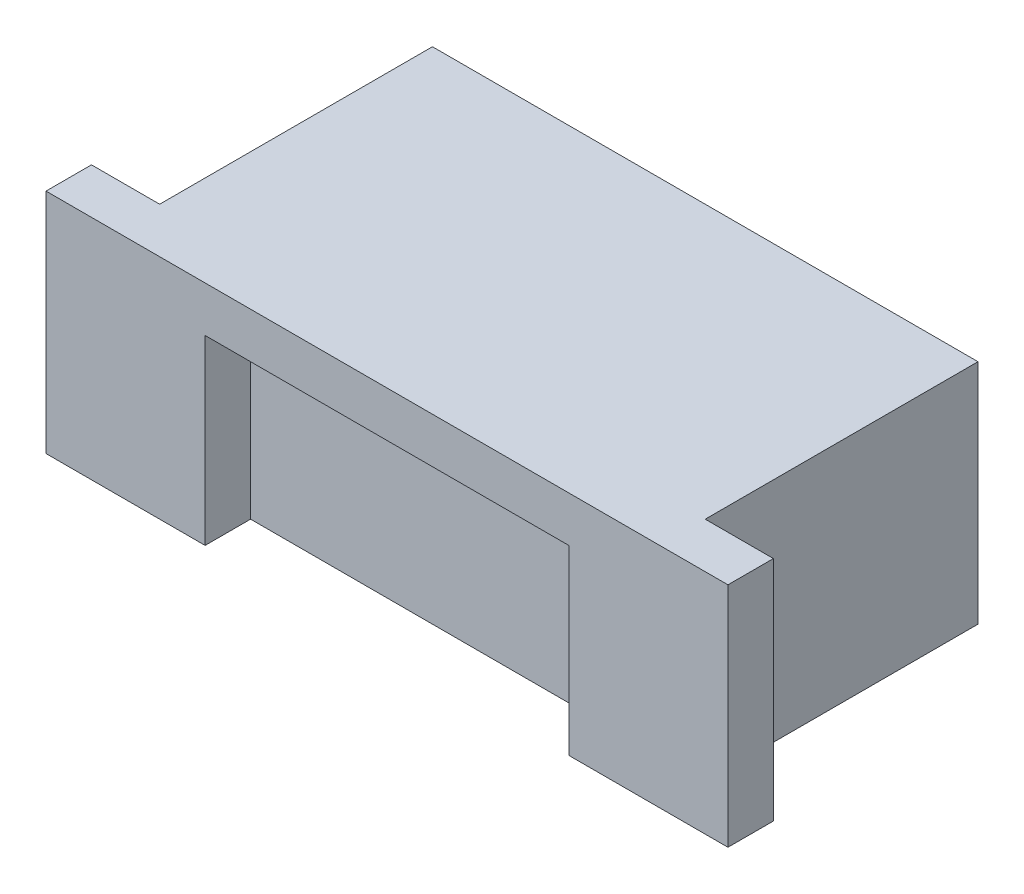
ISO-10303-21;
HEADER;
FILE_DESCRIPTION(('STEP AP214'),'2;1');
FILE_NAME('part.step','',(''),(''),'','','');
FILE_SCHEMA(('AUTOMOTIVE_DESIGN { 1 0 10303 214 1 1 1 1 }'));
ENDSEC;
DATA;
#1=APPLICATION_CONTEXT('core data for automotive mechanical design processes');
#2=APPLICATION_PROTOCOL_DEFINITION('international standard','automotive_design',2000,#1);
#3=PRODUCT_CONTEXT('',#1,'mechanical');
#4=PRODUCT('Part','Part','',(#3));
#5=PRODUCT_RELATED_PRODUCT_CATEGORY('part','',(#4));
#6=PRODUCT_DEFINITION_FORMATION('','',#4);
#7=PRODUCT_DEFINITION_CONTEXT('part definition',#1,'design');
#8=PRODUCT_DEFINITION('design','',#6,#7);
#9=PRODUCT_DEFINITION_SHAPE('','',#8);
#10=(LENGTH_UNIT() NAMED_UNIT(*) SI_UNIT(.MILLI.,.METRE.));
#11=(NAMED_UNIT(*) PLANE_ANGLE_UNIT() SI_UNIT($,.RADIAN.));
#12=(NAMED_UNIT(*) SI_UNIT($,.STERADIAN.) SOLID_ANGLE_UNIT());
#13=UNCERTAINTY_MEASURE_WITH_UNIT(LENGTH_MEASURE(1.E-05),#10,'distance_accuracy_value','');
#14=(GEOMETRIC_REPRESENTATION_CONTEXT(3) GLOBAL_UNCERTAINTY_ASSIGNED_CONTEXT((#13)) GLOBAL_UNIT_ASSIGNED_CONTEXT((#10,
#11,#12)) REPRESENTATION_CONTEXT('',''));
#15=CARTESIAN_POINT('',(0.,0.,0.));
#16=DIRECTION('',(0.,0.,1.));
#17=DIRECTION('',(1.,0.,0.));
#18=AXIS2_PLACEMENT_3D('',#15,#16,#17);
#19=CARTESIAN_POINT('',(0.,2.5,-0.5));
#20=DIRECTION('',(1.,0.,0.));
#21=DIRECTION('',(0.,0.,-1.));
#22=AXIS2_PLACEMENT_3D('',#19,#20,#21);
#23=PLANE('',#22);
#24=DIRECTION('',(0.,0.,1.));
#25=VECTOR('',#24,1.);
#26=CARTESIAN_POINT('',(0.,0.,-0.5));
#27=LINE('',#26,#25);
#28=CARTESIAN_POINT('',(0.,0.,-0.5));
#29=VERTEX_POINT('',#28);
#30=CARTESIAN_POINT('',(0.,0.,0.));
#31=VERTEX_POINT('',#30);
#32=EDGE_CURVE('E152',#29,#31,#27,.T.);
#33=ORIENTED_EDGE('',*,*,#32,.T.);
#34=DIRECTION('',(0.,-1.,0.));
#35=VECTOR('',#34,1.);
#36=CARTESIAN_POINT('',(0.,2.5,0.));
#37=LINE('',#36,#35);
#38=CARTESIAN_POINT('',(0.,2.5,0.));
#39=VERTEX_POINT('',#38);
#40=EDGE_CURVE('E11',#39,#31,#37,.T.);
#41=ORIENTED_EDGE('',*,*,#40,.F.);
#42=DIRECTION('',(0.,0.,1.));
#43=VECTOR('',#42,1.);
#44=CARTESIAN_POINT('',(0.,2.5,-0.5));
#45=LINE('',#44,#43);
#46=CARTESIAN_POINT('',(0.,2.5,-0.5));
#47=VERTEX_POINT('',#46);
#48=EDGE_CURVE('E178',#47,#39,#45,.T.);
#49=ORIENTED_EDGE('',*,*,#48,.F.);
#50=DIRECTION('',(0.,-1.,0.));
#51=VECTOR('',#50,1.);
#52=CARTESIAN_POINT('',(0.,2.5,-0.5));
#53=LINE('',#52,#51);
#54=EDGE_CURVE('E148',#47,#29,#53,.T.);
#55=ORIENTED_EDGE('',*,*,#54,.T.);
#56=EDGE_LOOP('',(#33,#41,#49,#55));
#57=FACE_BOUND('',#56,.T.);
#58=ADVANCED_FACE('F39',(#57),#23,.F.);
#59=CARTESIAN_POINT('',(0.,2.5,0.));
#60=DIRECTION('',(0.,0.,-1.));
#61=DIRECTION('',(-1.,0.,0.));
#62=AXIS2_PLACEMENT_3D('',#59,#60,#61);
#63=PLANE('',#62);
#64=DIRECTION('',(1.,0.,0.));
#65=VECTOR('',#64,1.);
#66=CARTESIAN_POINT('',(0.,0.,0.));
#67=LINE('',#66,#65);
#68=CARTESIAN_POINT('',(1.75,0.,0.));
#69=VERTEX_POINT('',#68);
#70=EDGE_CURVE('E158',#31,#69,#67,.T.);
#71=ORIENTED_EDGE('',*,*,#70,.T.);
#72=DIRECTION('',(0.,-1.,0.));
#73=VECTOR('',#72,1.);
#74=CARTESIAN_POINT('',(1.75,0.,0.));
#75=LINE('',#74,#73);
#76=CARTESIAN_POINT('',(1.75,2.,0.));
#77=VERTEX_POINT('',#76);
#78=EDGE_CURVE('E249',#77,#69,#75,.T.);
#79=ORIENTED_EDGE('',*,*,#78,.F.);
#80=DIRECTION('',(-1.,0.,0.));
#81=VECTOR('',#80,1.);
#82=CARTESIAN_POINT('',(1.75,2.,0.));
#83=LINE('',#82,#81);
#84=CARTESIAN_POINT('',(5.75,2.,0.));
#85=VERTEX_POINT('',#84);
#86=EDGE_CURVE('E241',#85,#77,#83,.T.);
#87=ORIENTED_EDGE('',*,*,#86,.F.);
#88=DIRECTION('',(0.,1.,0.));
#89=VECTOR('',#88,1.);
#90=CARTESIAN_POINT('',(5.75,0.,0.));
#91=LINE('',#90,#89);
#92=CARTESIAN_POINT('',(5.75,0.,0.));
#93=VERTEX_POINT('',#92);
#94=EDGE_CURVE('E245',#93,#85,#91,.T.);
#95=ORIENTED_EDGE('',*,*,#94,.F.);
#96=CARTESIAN_POINT('',(7.5,0.,0.));
#97=VERTEX_POINT('',#96);
#98=EDGE_CURVE('E156',#93,#97,#67,.T.);
#99=ORIENTED_EDGE('',*,*,#98,.T.);
#100=DIRECTION('',(0.,-1.,0.));
#101=VECTOR('',#100,1.);
#102=CARTESIAN_POINT('',(7.5,2.5,0.));
#103=LINE('',#102,#101);
#104=CARTESIAN_POINT('',(7.5,2.5,0.));
#105=VERTEX_POINT('',#104);
#106=EDGE_CURVE('E47',#105,#97,#103,.T.);
#107=ORIENTED_EDGE('',*,*,#106,.F.);
#108=DIRECTION('',(1.,0.,0.));
#109=VECTOR('',#108,1.);
#110=CARTESIAN_POINT('',(0.,2.5,0.));
#111=LINE('',#110,#109);
#112=EDGE_CURVE('E104',#39,#105,#111,.T.);
#113=ORIENTED_EDGE('',*,*,#112,.F.);
#114=ORIENTED_EDGE('',*,*,#40,.T.);
#115=EDGE_LOOP('',(#71,#79,#87,#95,#99,#107,#113,#114));
#116=FACE_BOUND('',#115,.T.);
#117=ADVANCED_FACE('F265',(#116),#63,.F.);
#118=CARTESIAN_POINT('',(7.5,2.5,0.));
#119=DIRECTION('',(-1.,0.,0.));
#120=DIRECTION('',(0.,0.,1.));
#121=AXIS2_PLACEMENT_3D('',#118,#119,#120);
#122=PLANE('',#121);
#123=DIRECTION('',(0.,0.,-1.));
#124=VECTOR('',#123,1.);
#125=CARTESIAN_POINT('',(7.5,0.,0.));
#126=LINE('',#125,#124);
#127=CARTESIAN_POINT('',(7.5,0.,-0.500000000000001));
#128=VERTEX_POINT('',#127);
#129=EDGE_CURVE('E162',#97,#128,#126,.T.);
#130=ORIENTED_EDGE('',*,*,#129,.T.);
#131=DIRECTION('',(0.,-1.,0.));
#132=VECTOR('',#131,1.);
#133=CARTESIAN_POINT('',(7.5,2.5,-0.500000000000001));
#134=LINE('',#133,#132);
#135=CARTESIAN_POINT('',(7.5,2.5,-0.500000000000001));
#136=VERTEX_POINT('',#135);
#137=EDGE_CURVE('E189',#136,#128,#134,.T.);
#138=ORIENTED_EDGE('',*,*,#137,.F.);
#139=DIRECTION('',(0.,0.,-1.));
#140=VECTOR('',#139,1.);
#141=CARTESIAN_POINT('',(7.5,2.5,0.));
#142=LINE('',#141,#140);
#143=EDGE_CURVE('E199',#105,#136,#142,.T.);
#144=ORIENTED_EDGE('',*,*,#143,.F.);
#145=ORIENTED_EDGE('',*,*,#106,.T.);
#146=EDGE_LOOP('',(#130,#138,#144,#145));
#147=FACE_BOUND('',#146,.T.);
#148=ADVANCED_FACE('F197',(#147),#122,.F.);
#149=CARTESIAN_POINT('',(7.5,2.5,-0.500000000000001));
#150=DIRECTION('',(0.,0.,1.));
#151=DIRECTION('',(1.,0.,0.));
#152=AXIS2_PLACEMENT_3D('',#149,#150,#151);
#153=PLANE('',#152);
#154=DIRECTION('',(-1.,0.,0.));
#155=VECTOR('',#154,1.);
#156=CARTESIAN_POINT('',(7.5,0.,-0.500000000000001));
#157=LINE('',#156,#155);
#158=CARTESIAN_POINT('',(6.75,0.,-0.500000000000001));
#159=VERTEX_POINT('',#158);
#160=EDGE_CURVE('E165',#128,#159,#157,.T.);
#161=ORIENTED_EDGE('',*,*,#160,.T.);
#162=DIRECTION('',(0.,-1.,0.));
#163=VECTOR('',#162,1.);
#164=CARTESIAN_POINT('',(6.75,2.5,-0.500000000000001));
#165=LINE('',#164,#163);
#166=CARTESIAN_POINT('',(6.75,2.5,-0.500000000000001));
#167=VERTEX_POINT('',#166);
#168=EDGE_CURVE('E185',#167,#159,#165,.T.);
#169=ORIENTED_EDGE('',*,*,#168,.F.);
#170=DIRECTION('',(-1.,0.,0.));
#171=VECTOR('',#170,1.);
#172=CARTESIAN_POINT('',(7.5,2.5,-0.500000000000001));
#173=LINE('',#172,#171);
#174=EDGE_CURVE('E215',#136,#167,#173,.T.);
#175=ORIENTED_EDGE('',*,*,#174,.F.);
#176=ORIENTED_EDGE('',*,*,#137,.T.);
#177=EDGE_LOOP('',(#161,#169,#175,#176));
#178=FACE_BOUND('',#177,.T.);
#179=ADVANCED_FACE('F210',(#178),#153,.F.);
#180=CARTESIAN_POINT('',(6.75,2.5,-0.500000000000001));
#181=DIRECTION('',(-1.,0.,0.));
#182=DIRECTION('',(0.,0.,1.));
#183=AXIS2_PLACEMENT_3D('',#180,#181,#182);
#184=PLANE('',#183);
#185=DIRECTION('',(0.,0.,-1.));
#186=VECTOR('',#185,1.);
#187=CARTESIAN_POINT('',(6.75,0.,-0.500000000000001));
#188=LINE('',#187,#186);
#189=CARTESIAN_POINT('',(6.75,0.,-3.5));
#190=VERTEX_POINT('',#189);
#191=EDGE_CURVE('E168',#159,#190,#188,.T.);
#192=ORIENTED_EDGE('',*,*,#191,.T.);
#193=DIRECTION('',(0.,-1.,0.));
#194=VECTOR('',#193,1.);
#195=CARTESIAN_POINT('',(6.75,2.5,-3.5));
#196=LINE('',#195,#194);
#197=CARTESIAN_POINT('',(6.75,2.5,-3.5));
#198=VERTEX_POINT('',#197);
#199=EDGE_CURVE('E141',#198,#190,#196,.T.);
#200=ORIENTED_EDGE('',*,*,#199,.F.);
#201=DIRECTION('',(0.,0.,-1.));
#202=VECTOR('',#201,1.);
#203=CARTESIAN_POINT('',(6.75,2.5,-0.500000000000001));
#204=LINE('',#203,#202);
#205=EDGE_CURVE('E127',#167,#198,#204,.T.);
#206=ORIENTED_EDGE('',*,*,#205,.F.);
#207=ORIENTED_EDGE('',*,*,#168,.T.);
#208=EDGE_LOOP('',(#192,#200,#206,#207));
#209=FACE_BOUND('',#208,.T.);
#210=ADVANCED_FACE('F213',(#209),#184,.F.);
#211=CARTESIAN_POINT('',(6.75,2.5,-3.5));
#212=DIRECTION('',(0.,0.,1.));
#213=DIRECTION('',(1.,0.,0.));
#214=AXIS2_PLACEMENT_3D('',#211,#212,#213);
#215=PLANE('',#214);
#216=DIRECTION('',(-1.,0.,0.));
#217=VECTOR('',#216,1.);
#218=CARTESIAN_POINT('',(6.75,0.,-3.5));
#219=LINE('',#218,#217);
#220=CARTESIAN_POINT('',(0.750000000000001,0.,-3.5));
#221=VERTEX_POINT('',#220);
#222=EDGE_CURVE('E137',#190,#221,#219,.T.);
#223=ORIENTED_EDGE('',*,*,#222,.T.);
#224=DIRECTION('',(0.,-1.,0.));
#225=VECTOR('',#224,1.);
#226=CARTESIAN_POINT('',(0.750000000000001,2.5,-3.5));
#227=LINE('',#226,#225);
#228=CARTESIAN_POINT('',(0.750000000000001,2.5,-3.5));
#229=VERTEX_POINT('',#228);
#230=EDGE_CURVE('E134',#229,#221,#227,.T.);
#231=ORIENTED_EDGE('',*,*,#230,.F.);
#232=DIRECTION('',(-1.,0.,0.));
#233=VECTOR('',#232,1.);
#234=CARTESIAN_POINT('',(6.75,2.5,-3.5));
#235=LINE('',#234,#233);
#236=EDGE_CURVE('E120',#198,#229,#235,.T.);
#237=ORIENTED_EDGE('',*,*,#236,.F.);
#238=ORIENTED_EDGE('',*,*,#199,.T.);
#239=EDGE_LOOP('',(#223,#231,#237,#238));
#240=FACE_BOUND('',#239,.T.);
#241=ADVANCED_FACE('F135',(#240),#215,.F.);
#242=CARTESIAN_POINT('',(0.750000000000001,2.5,-3.5));
#243=DIRECTION('',(1.,0.,0.));
#244=DIRECTION('',(0.,0.,-1.));
#245=AXIS2_PLACEMENT_3D('',#242,#243,#244);
#246=PLANE('',#245);
#247=DIRECTION('',(0.,0.,1.));
#248=VECTOR('',#247,1.);
#249=CARTESIAN_POINT('',(0.750000000000001,0.,-3.5));
#250=LINE('',#249,#248);
#251=CARTESIAN_POINT('',(0.75,0.,-0.5));
#252=VERTEX_POINT('',#251);
#253=EDGE_CURVE('E173',#221,#252,#250,.T.);
#254=ORIENTED_EDGE('',*,*,#253,.T.);
#255=DIRECTION('',(0.,-1.,0.));
#256=VECTOR('',#255,1.);
#257=CARTESIAN_POINT('',(0.75,2.5,-0.5));
#258=LINE('',#257,#256);
#259=CARTESIAN_POINT('',(0.75,2.5,-0.5));
#260=VERTEX_POINT('',#259);
#261=EDGE_CURVE('E142',#260,#252,#258,.T.);
#262=ORIENTED_EDGE('',*,*,#261,.F.);
#263=DIRECTION('',(0.,0.,1.));
#264=VECTOR('',#263,1.);
#265=CARTESIAN_POINT('',(0.750000000000001,2.5,-3.5));
#266=LINE('',#265,#264);
#267=EDGE_CURVE('E124',#229,#260,#266,.T.);
#268=ORIENTED_EDGE('',*,*,#267,.F.);
#269=ORIENTED_EDGE('',*,*,#230,.T.);
#270=EDGE_LOOP('',(#254,#262,#268,#269));
#271=FACE_BOUND('',#270,.T.);
#272=ADVANCED_FACE('F144',(#271),#246,.F.);
#273=CARTESIAN_POINT('',(0.75,2.5,-0.5));
#274=DIRECTION('',(0.,0.,1.));
#275=DIRECTION('',(1.,0.,0.));
#276=AXIS2_PLACEMENT_3D('',#273,#274,#275);
#277=PLANE('',#276);
#278=DIRECTION('',(-1.,0.,0.));
#279=VECTOR('',#278,1.);
#280=CARTESIAN_POINT('',(0.75,0.,-0.5));
#281=LINE('',#280,#279);
#282=EDGE_CURVE('E96',#252,#29,#281,.T.);
#283=ORIENTED_EDGE('',*,*,#282,.T.);
#284=ORIENTED_EDGE('',*,*,#54,.F.);
#285=DIRECTION('',(-1.,0.,0.));
#286=VECTOR('',#285,1.);
#287=CARTESIAN_POINT('',(0.75,2.5,-0.5));
#288=LINE('',#287,#286);
#289=EDGE_CURVE('E63',#260,#47,#288,.T.);
#290=ORIENTED_EDGE('',*,*,#289,.F.);
#291=ORIENTED_EDGE('',*,*,#261,.T.);
#292=EDGE_LOOP('',(#283,#284,#290,#291));
#293=FACE_BOUND('',#292,.T.);
#294=ADVANCED_FACE('F290',(#293),#277,.F.);
#295=CARTESIAN_POINT('',(0.,2.5,0.));
#296=DIRECTION('',(0.,1.,0.));
#297=DIRECTION('',(0.,0.,1.));
#298=AXIS2_PLACEMENT_3D('',#295,#296,#297);
#299=PLANE('',#298);
#300=ORIENTED_EDGE('',*,*,#48,.T.);
#301=ORIENTED_EDGE('',*,*,#112,.T.);
#302=ORIENTED_EDGE('',*,*,#143,.T.);
#303=ORIENTED_EDGE('',*,*,#174,.T.);
#304=ORIENTED_EDGE('',*,*,#205,.T.);
#305=ORIENTED_EDGE('',*,*,#236,.T.);
#306=ORIENTED_EDGE('',*,*,#267,.T.);
#307=ORIENTED_EDGE('',*,*,#289,.T.);
#308=EDGE_LOOP('',(#300,#301,#302,#303,#304,#305,#306,#307));
#309=FACE_BOUND('',#308,.T.);
#310=ADVANCED_FACE('F122',(#309),#299,.T.);
#311=CARTESIAN_POINT('',(0.,0.,0.));
#312=DIRECTION('',(0.,1.,0.));
#313=DIRECTION('',(0.,0.,1.));
#314=AXIS2_PLACEMENT_3D('',#311,#312,#313);
#315=PLANE('',#314);
#316=DIRECTION('',(1.,0.,0.));
#317=VECTOR('',#316,1.);
#318=CARTESIAN_POINT('',(1.75,0.,-0.5));
#319=LINE('',#318,#317);
#320=CARTESIAN_POINT('',(1.75,0.,-0.5));
#321=VERTEX_POINT('',#320);
#322=CARTESIAN_POINT('',(5.75,0.,-0.5));
#323=VERTEX_POINT('',#322);
#324=EDGE_CURVE('E259',#321,#323,#319,.T.);
#325=ORIENTED_EDGE('',*,*,#324,.F.);
#326=DIRECTION('',(0.,0.,1.));
#327=VECTOR('',#326,1.);
#328=CARTESIAN_POINT('',(1.75,0.,-0.5));
#329=LINE('',#328,#327);
#330=EDGE_CURVE('E225',#321,#69,#329,.T.);
#331=ORIENTED_EDGE('',*,*,#330,.T.);
#332=ORIENTED_EDGE('',*,*,#70,.F.);
#333=ORIENTED_EDGE('',*,*,#32,.F.);
#334=ORIENTED_EDGE('',*,*,#282,.F.);
#335=ORIENTED_EDGE('',*,*,#253,.F.);
#336=ORIENTED_EDGE('',*,*,#222,.F.);
#337=ORIENTED_EDGE('',*,*,#191,.F.);
#338=ORIENTED_EDGE('',*,*,#160,.F.);
#339=ORIENTED_EDGE('',*,*,#129,.F.);
#340=ORIENTED_EDGE('',*,*,#98,.F.);
#341=DIRECTION('',(0.,0.,1.));
#342=VECTOR('',#341,1.);
#343=CARTESIAN_POINT('',(5.75,0.,-0.5));
#344=LINE('',#343,#342);
#345=EDGE_CURVE('E229',#323,#93,#344,.T.);
#346=ORIENTED_EDGE('',*,*,#345,.F.);
#347=EDGE_LOOP('',(#325,#331,#332,#333,#334,#335,#336,#337,#338,#339,#340,#346));
#348=FACE_BOUND('',#347,.T.);
#349=ADVANCED_FACE('F204',(#348),#315,.F.);
#350=CARTESIAN_POINT('',(1.75,0.,-0.5));
#351=DIRECTION('',(-1.,0.,0.));
#352=DIRECTION('',(0.,-1.,0.));
#353=AXIS2_PLACEMENT_3D('',#350,#351,#352);
#354=PLANE('',#353);
#355=ORIENTED_EDGE('',*,*,#78,.T.);
#356=ORIENTED_EDGE('',*,*,#330,.F.);
#357=DIRECTION('',(0.,-1.,0.));
#358=VECTOR('',#357,1.);
#359=CARTESIAN_POINT('',(1.75,0.,-0.5));
#360=LINE('',#359,#358);
#361=CARTESIAN_POINT('',(1.75,2.,-0.5));
#362=VERTEX_POINT('',#361);
#363=EDGE_CURVE('E54',#362,#321,#360,.T.);
#364=ORIENTED_EDGE('',*,*,#363,.F.);
#365=DIRECTION('',(0.,0.,1.));
#366=VECTOR('',#365,1.);
#367=CARTESIAN_POINT('',(1.75,2.,-0.5));
#368=LINE('',#367,#366);
#369=EDGE_CURVE('E157',#362,#77,#368,.T.);
#370=ORIENTED_EDGE('',*,*,#369,.T.);
#371=EDGE_LOOP('',(#355,#356,#364,#370));
#372=FACE_BOUND('',#371,.T.);
#373=ADVANCED_FACE('F347',(#372),#354,.F.);
#374=CARTESIAN_POINT('',(1.75,2.,-0.5));
#375=DIRECTION('',(0.,1.,0.));
#376=DIRECTION('',(0.,0.,1.));
#377=AXIS2_PLACEMENT_3D('',#374,#375,#376);
#378=PLANE('',#377);
#379=ORIENTED_EDGE('',*,*,#86,.T.);
#380=ORIENTED_EDGE('',*,*,#369,.F.);
#381=DIRECTION('',(-1.,0.,0.));
#382=VECTOR('',#381,1.);
#383=CARTESIAN_POINT('',(1.75,2.,-0.5));
#384=LINE('',#383,#382);
#385=CARTESIAN_POINT('',(5.75,2.,-0.5));
#386=VERTEX_POINT('',#385);
#387=EDGE_CURVE('E230',#386,#362,#384,.T.);
#388=ORIENTED_EDGE('',*,*,#387,.F.);
#389=DIRECTION('',(0.,0.,1.));
#390=VECTOR('',#389,1.);
#391=CARTESIAN_POINT('',(5.75,2.,-0.5));
#392=LINE('',#391,#390);
#393=EDGE_CURVE('E234',#386,#85,#392,.T.);
#394=ORIENTED_EDGE('',*,*,#393,.T.);
#395=EDGE_LOOP('',(#379,#380,#388,#394));
#396=FACE_BOUND('',#395,.T.);
#397=ADVANCED_FACE('F355',(#396),#378,.F.);
#398=CARTESIAN_POINT('',(5.75,0.,-0.5));
#399=DIRECTION('',(1.,0.,0.));
#400=DIRECTION('',(0.,1.,0.));
#401=AXIS2_PLACEMENT_3D('',#398,#399,#400);
#402=PLANE('',#401);
#403=ORIENTED_EDGE('',*,*,#94,.T.);
#404=ORIENTED_EDGE('',*,*,#393,.F.);
#405=DIRECTION('',(0.,1.,0.));
#406=VECTOR('',#405,1.);
#407=CARTESIAN_POINT('',(5.75,0.,-0.5));
#408=LINE('',#407,#406);
#409=EDGE_CURVE('E255',#323,#386,#408,.T.);
#410=ORIENTED_EDGE('',*,*,#409,.F.);
#411=ORIENTED_EDGE('',*,*,#345,.T.);
#412=EDGE_LOOP('',(#403,#404,#410,#411));
#413=FACE_BOUND('',#412,.T.);
#414=ADVANCED_FACE('F273',(#413),#402,.F.);
#415=CARTESIAN_POINT('',(0.,0.,-0.5));
#416=DIRECTION('',(0.,0.,-1.));
#417=DIRECTION('',(-1.,0.,0.));
#418=AXIS2_PLACEMENT_3D('',#415,#416,#417);
#419=PLANE('',#418);
#420=ORIENTED_EDGE('',*,*,#363,.T.);
#421=ORIENTED_EDGE('',*,*,#324,.T.);
#422=ORIENTED_EDGE('',*,*,#409,.T.);
#423=ORIENTED_EDGE('',*,*,#387,.T.);
#424=EDGE_LOOP('',(#420,#421,#422,#423));
#425=FACE_BOUND('',#424,.T.);
#426=ADVANCED_FACE('F284',(#425),#419,.F.);
#427=CLOSED_SHELL('',(#58,#117,#148,#179,#210,#241,#272,#294,#310,#349,#373,#397,#414,#426));
#428=MANIFOLD_SOLID_BREP('B2',#427);
#429=ADVANCED_BREP_SHAPE_REPRESENTATION('',(#18,#428),#14);
#430=SHAPE_DEFINITION_REPRESENTATION(#9,#429);
ENDSEC;
END-ISO-10303-21;
